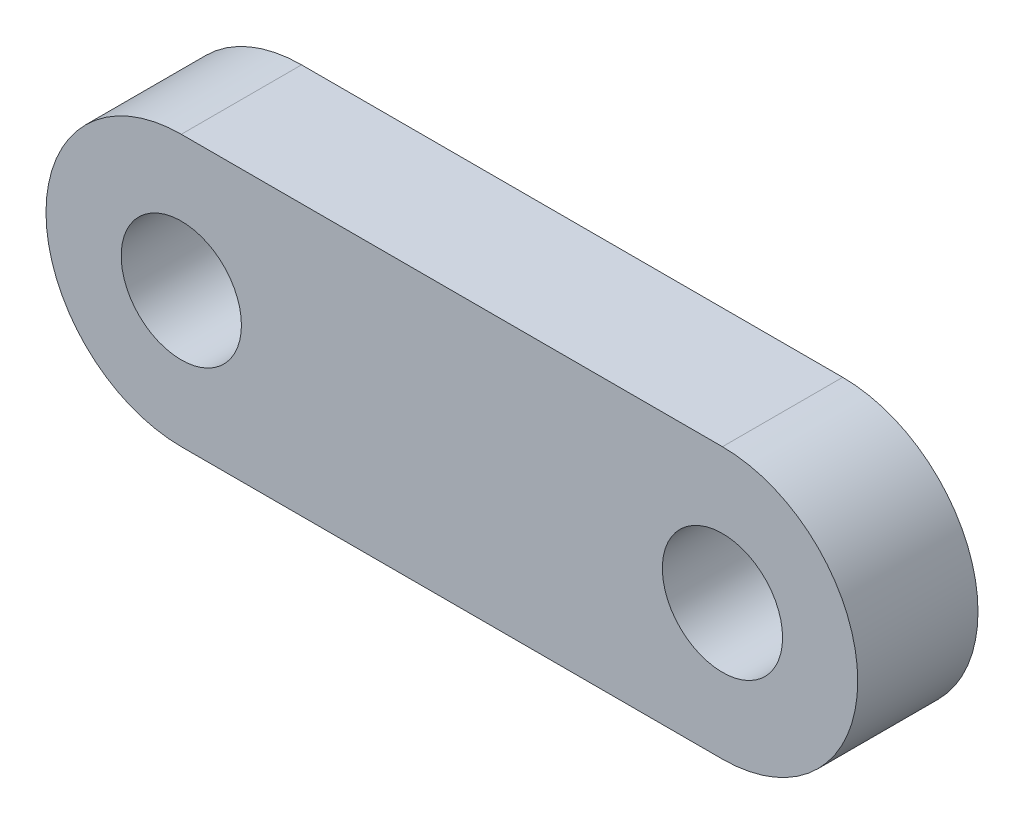
ISO-10303-21;
HEADER;
FILE_DESCRIPTION(('STEP AP214'),'2;1');
FILE_NAME('part.step','',(''),(''),'','','');
FILE_SCHEMA(('AUTOMOTIVE_DESIGN { 1 0 10303 214 1 1 1 1 }'));
ENDSEC;
DATA;
#1=APPLICATION_CONTEXT('core data for automotive mechanical design processes');
#2=APPLICATION_PROTOCOL_DEFINITION('international standard','automotive_design',2000,#1);
#3=PRODUCT_CONTEXT('',#1,'mechanical');
#4=PRODUCT('Part','Part','',(#3));
#5=PRODUCT_RELATED_PRODUCT_CATEGORY('part','',(#4));
#6=PRODUCT_DEFINITION_FORMATION('','',#4);
#7=PRODUCT_DEFINITION_CONTEXT('part definition',#1,'design');
#8=PRODUCT_DEFINITION('design','',#6,#7);
#9=PRODUCT_DEFINITION_SHAPE('','',#8);
#10=(LENGTH_UNIT() NAMED_UNIT(*) SI_UNIT(.MILLI.,.METRE.));
#11=(NAMED_UNIT(*) PLANE_ANGLE_UNIT() SI_UNIT($,.RADIAN.));
#12=(NAMED_UNIT(*) SI_UNIT($,.STERADIAN.) SOLID_ANGLE_UNIT());
#13=UNCERTAINTY_MEASURE_WITH_UNIT(LENGTH_MEASURE(1.E-05),#10,'distance_accuracy_value','');
#14=(GEOMETRIC_REPRESENTATION_CONTEXT(3) GLOBAL_UNCERTAINTY_ASSIGNED_CONTEXT((#13)) GLOBAL_UNIT_ASSIGNED_CONTEXT((#10,
#11,#12)) REPRESENTATION_CONTEXT('',''));
#15=CARTESIAN_POINT('',(0.,0.,0.));
#16=DIRECTION('',(0.,0.,1.));
#17=DIRECTION('',(1.,0.,0.));
#18=AXIS2_PLACEMENT_3D('',#15,#16,#17);
#19=CARTESIAN_POINT('',(0.,0.,4.));
#20=DIRECTION('',(0.,0.,1.));
#21=DIRECTION('',(1.,0.,0.));
#22=AXIS2_PLACEMENT_3D('',#19,#20,#21);
#23=PLANE('',#22);
#24=CARTESIAN_POINT('',(0.,0.,4.));
#25=DIRECTION('',(0.,0.,1.));
#26=DIRECTION('',(1.,0.,0.));
#27=AXIS2_PLACEMENT_3D('',#24,#25,#26);
#28=CIRCLE('',#27,2.);
#29=CARTESIAN_POINT('',(2.,0.,4.));
#30=VERTEX_POINT('',#29);
#31=EDGE_CURVE('E98',#30,#30,#28,.T.);
#32=ORIENTED_EDGE('',*,*,#31,.F.);
#33=EDGE_LOOP('',(#32));
#34=FACE_BOUND('',#33,.T.);
#35=CARTESIAN_POINT('',(0.,0.,4.));
#36=DIRECTION('',(0.,0.,1.));
#37=DIRECTION('',(1.,0.,0.));
#38=AXIS2_PLACEMENT_3D('',#35,#36,#37);
#39=CIRCLE('',#38,4.5);
#40=CARTESIAN_POINT('',(0.,4.5,4.));
#41=VERTEX_POINT('',#40);
#42=CARTESIAN_POINT('',(0.,-4.5,4.));
#43=VERTEX_POINT('',#42);
#44=EDGE_CURVE('E83',#41,#43,#39,.T.);
#45=ORIENTED_EDGE('',*,*,#44,.T.);
#46=DIRECTION('',(1.,0.,0.));
#47=VECTOR('',#46,1.);
#48=CARTESIAN_POINT('',(0.,-4.5,4.));
#49=LINE('',#48,#47);
#50=CARTESIAN_POINT('',(18.,-4.5,4.));
#51=VERTEX_POINT('',#50);
#52=EDGE_CURVE('E78',#43,#51,#49,.T.);
#53=ORIENTED_EDGE('',*,*,#52,.T.);
#54=CARTESIAN_POINT('',(18.,0.,4.));
#55=DIRECTION('',(0.,0.,1.));
#56=DIRECTION('',(1.,0.,0.));
#57=AXIS2_PLACEMENT_3D('',#54,#55,#56);
#58=CIRCLE('',#57,4.5);
#59=CARTESIAN_POINT('',(18.,4.5,4.));
#60=VERTEX_POINT('',#59);
#61=EDGE_CURVE('E81',#51,#60,#58,.T.);
#62=ORIENTED_EDGE('',*,*,#61,.T.);
#63=DIRECTION('',(-1.,0.,0.));
#64=VECTOR('',#63,1.);
#65=CARTESIAN_POINT('',(0.,4.5,4.));
#66=LINE('',#65,#64);
#67=EDGE_CURVE('E48',#60,#41,#66,.T.);
#68=ORIENTED_EDGE('',*,*,#67,.T.);
#69=EDGE_LOOP('',(#45,#53,#62,#68));
#70=FACE_BOUND('',#69,.T.);
#71=CARTESIAN_POINT('',(18.,0.,4.));
#72=DIRECTION('',(0.,0.,1.));
#73=DIRECTION('',(1.,0.,0.));
#74=AXIS2_PLACEMENT_3D('',#71,#72,#73);
#75=CIRCLE('',#74,2.);
#76=CARTESIAN_POINT('',(20.,0.,4.));
#77=VERTEX_POINT('',#76);
#78=EDGE_CURVE('E113',#77,#77,#75,.T.);
#79=ORIENTED_EDGE('',*,*,#78,.F.);
#80=EDGE_LOOP('',(#79));
#81=FACE_BOUND('',#80,.T.);
#82=ADVANCED_FACE('F31',(#34,#70,#81),#23,.T.);
#83=CARTESIAN_POINT('',(0.,0.,0.));
#84=DIRECTION('',(0.,0.,1.));
#85=DIRECTION('',(1.,0.,0.));
#86=AXIS2_PLACEMENT_3D('',#83,#84,#85);
#87=PLANE('',#86);
#88=CARTESIAN_POINT('',(0.,0.,0.));
#89=DIRECTION('',(0.,0.,1.));
#90=DIRECTION('',(1.,0.,0.));
#91=AXIS2_PLACEMENT_3D('',#88,#89,#90);
#92=CIRCLE('',#91,2.);
#93=CARTESIAN_POINT('',(2.,0.,0.));
#94=VERTEX_POINT('',#93);
#95=EDGE_CURVE('E110',#94,#94,#92,.T.);
#96=ORIENTED_EDGE('',*,*,#95,.T.);
#97=EDGE_LOOP('',(#96));
#98=FACE_BOUND('',#97,.T.);
#99=CARTESIAN_POINT('',(0.,0.,0.));
#100=DIRECTION('',(0.,0.,1.));
#101=DIRECTION('',(1.,0.,0.));
#102=AXIS2_PLACEMENT_3D('',#99,#100,#101);
#103=CIRCLE('',#102,4.5);
#104=CARTESIAN_POINT('',(0.,4.5,0.));
#105=VERTEX_POINT('',#104);
#106=CARTESIAN_POINT('',(0.,-4.5,0.));
#107=VERTEX_POINT('',#106);
#108=EDGE_CURVE('E95',#105,#107,#103,.T.);
#109=ORIENTED_EDGE('',*,*,#108,.F.);
#110=DIRECTION('',(-1.,0.,0.));
#111=VECTOR('',#110,1.);
#112=CARTESIAN_POINT('',(0.,4.5,0.));
#113=LINE('',#112,#111);
#114=CARTESIAN_POINT('',(18.,4.5,0.));
#115=VERTEX_POINT('',#114);
#116=EDGE_CURVE('E71',#115,#105,#113,.T.);
#117=ORIENTED_EDGE('',*,*,#116,.F.);
#118=CARTESIAN_POINT('',(18.,0.,0.));
#119=DIRECTION('',(0.,0.,1.));
#120=DIRECTION('',(1.,0.,0.));
#121=AXIS2_PLACEMENT_3D('',#118,#119,#120);
#122=CIRCLE('',#121,4.5);
#123=CARTESIAN_POINT('',(18.,-4.5,0.));
#124=VERTEX_POINT('',#123);
#125=EDGE_CURVE('E65',#124,#115,#122,.T.);
#126=ORIENTED_EDGE('',*,*,#125,.F.);
#127=DIRECTION('',(1.,0.,0.));
#128=VECTOR('',#127,1.);
#129=CARTESIAN_POINT('',(0.,-4.5,0.));
#130=LINE('',#129,#128);
#131=EDGE_CURVE('E87',#107,#124,#130,.T.);
#132=ORIENTED_EDGE('',*,*,#131,.F.);
#133=EDGE_LOOP('',(#109,#117,#126,#132));
#134=FACE_BOUND('',#133,.T.);
#135=CARTESIAN_POINT('',(18.,0.,0.));
#136=DIRECTION('',(0.,0.,1.));
#137=DIRECTION('',(1.,0.,0.));
#138=AXIS2_PLACEMENT_3D('',#135,#136,#137);
#139=CIRCLE('',#138,2.);
#140=CARTESIAN_POINT('',(20.,0.,0.));
#141=VERTEX_POINT('',#140);
#142=EDGE_CURVE('E116',#141,#141,#139,.T.);
#143=ORIENTED_EDGE('',*,*,#142,.T.);
#144=EDGE_LOOP('',(#143));
#145=FACE_BOUND('',#144,.T.);
#146=ADVANCED_FACE('F106',(#98,#134,#145),#87,.F.);
#147=CARTESIAN_POINT('',(0.,0.,4.));
#148=DIRECTION('',(0.,0.,-1.));
#149=DIRECTION('',(-1.,0.,0.));
#150=AXIS2_PLACEMENT_3D('',#147,#148,#149);
#151=CYLINDRICAL_SURFACE('',#150,4.5);
#152=ORIENTED_EDGE('',*,*,#108,.T.);
#153=DIRECTION('',(0.,0.,-1.));
#154=VECTOR('',#153,1.);
#155=CARTESIAN_POINT('',(0.,-4.5,4.));
#156=LINE('',#155,#154);
#157=EDGE_CURVE('E11',#43,#107,#156,.T.);
#158=ORIENTED_EDGE('',*,*,#157,.F.);
#159=ORIENTED_EDGE('',*,*,#44,.F.);
#160=DIRECTION('',(0.,0.,-1.));
#161=VECTOR('',#160,1.);
#162=CARTESIAN_POINT('',(0.,4.5,4.));
#163=LINE('',#162,#161);
#164=EDGE_CURVE('E91',#41,#105,#163,.T.);
#165=ORIENTED_EDGE('',*,*,#164,.T.);
#166=EDGE_LOOP('',(#152,#158,#159,#165));
#167=FACE_BOUND('',#166,.T.);
#168=ADVANCED_FACE('F33',(#167),#151,.T.);
#169=CARTESIAN_POINT('',(0.,-4.5,4.));
#170=DIRECTION('',(0.,1.,0.));
#171=DIRECTION('',(0.,0.,1.));
#172=AXIS2_PLACEMENT_3D('',#169,#170,#171);
#173=PLANE('',#172);
#174=ORIENTED_EDGE('',*,*,#131,.T.);
#175=DIRECTION('',(0.,0.,-1.));
#176=VECTOR('',#175,1.);
#177=CARTESIAN_POINT('',(18.,-4.5,4.));
#178=LINE('',#177,#176);
#179=EDGE_CURVE('E40',#51,#124,#178,.T.);
#180=ORIENTED_EDGE('',*,*,#179,.F.);
#181=ORIENTED_EDGE('',*,*,#52,.F.);
#182=ORIENTED_EDGE('',*,*,#157,.T.);
#183=EDGE_LOOP('',(#174,#180,#181,#182));
#184=FACE_BOUND('',#183,.T.);
#185=ADVANCED_FACE('F86',(#184),#173,.F.);
#186=CARTESIAN_POINT('',(18.,0.,4.));
#187=DIRECTION('',(0.,0.,-1.));
#188=DIRECTION('',(-1.,0.,0.));
#189=AXIS2_PLACEMENT_3D('',#186,#187,#188);
#190=CYLINDRICAL_SURFACE('',#189,4.5);
#191=ORIENTED_EDGE('',*,*,#125,.T.);
#192=DIRECTION('',(0.,0.,-1.));
#193=VECTOR('',#192,1.);
#194=CARTESIAN_POINT('',(18.,4.5,4.));
#195=LINE('',#194,#193);
#196=EDGE_CURVE('E88',#60,#115,#195,.T.);
#197=ORIENTED_EDGE('',*,*,#196,.F.);
#198=ORIENTED_EDGE('',*,*,#61,.F.);
#199=ORIENTED_EDGE('',*,*,#179,.T.);
#200=EDGE_LOOP('',(#191,#197,#198,#199));
#201=FACE_BOUND('',#200,.T.);
#202=ADVANCED_FACE('F89',(#201),#190,.T.);
#203=CARTESIAN_POINT('',(0.,4.5,4.));
#204=DIRECTION('',(0.,-1.,0.));
#205=DIRECTION('',(0.,0.,-1.));
#206=AXIS2_PLACEMENT_3D('',#203,#204,#205);
#207=PLANE('',#206);
#208=ORIENTED_EDGE('',*,*,#116,.T.);
#209=ORIENTED_EDGE('',*,*,#164,.F.);
#210=ORIENTED_EDGE('',*,*,#67,.F.);
#211=ORIENTED_EDGE('',*,*,#196,.T.);
#212=EDGE_LOOP('',(#208,#209,#210,#211));
#213=FACE_BOUND('',#212,.T.);
#214=ADVANCED_FACE('F103',(#213),#207,.F.);
#215=CARTESIAN_POINT('',(0.,0.,4.));
#216=DIRECTION('',(0.,0.,-1.));
#217=DIRECTION('',(-1.,0.,0.));
#218=AXIS2_PLACEMENT_3D('',#215,#216,#217);
#219=CYLINDRICAL_SURFACE('',#218,2.);
#220=ORIENTED_EDGE('',*,*,#31,.T.);
#221=EDGE_LOOP('',(#220));
#222=FACE_BOUND('',#221,.T.);
#223=ORIENTED_EDGE('',*,*,#95,.F.);
#224=EDGE_LOOP('',(#223));
#225=FACE_BOUND('',#224,.T.);
#226=ADVANCED_FACE('F134',(#222,#225),#219,.F.);
#227=CARTESIAN_POINT('',(18.,0.,4.));
#228=DIRECTION('',(0.,0.,-1.));
#229=DIRECTION('',(-1.,0.,0.));
#230=AXIS2_PLACEMENT_3D('',#227,#228,#229);
#231=CYLINDRICAL_SURFACE('',#230,2.);
#232=ORIENTED_EDGE('',*,*,#78,.T.);
#233=EDGE_LOOP('',(#232));
#234=FACE_BOUND('',#233,.T.);
#235=ORIENTED_EDGE('',*,*,#142,.F.);
#236=EDGE_LOOP('',(#235));
#237=FACE_BOUND('',#236,.T.);
#238=ADVANCED_FACE('F122',(#234,#237),#231,.F.);
#239=CLOSED_SHELL('',(#82,#146,#168,#185,#202,#214,#226,#238));
#240=MANIFOLD_SOLID_BREP('B2',#239);
#241=ADVANCED_BREP_SHAPE_REPRESENTATION('',(#18,#240),#14);
#242=SHAPE_DEFINITION_REPRESENTATION(#9,#241);
ENDSEC;
END-ISO-10303-21;
